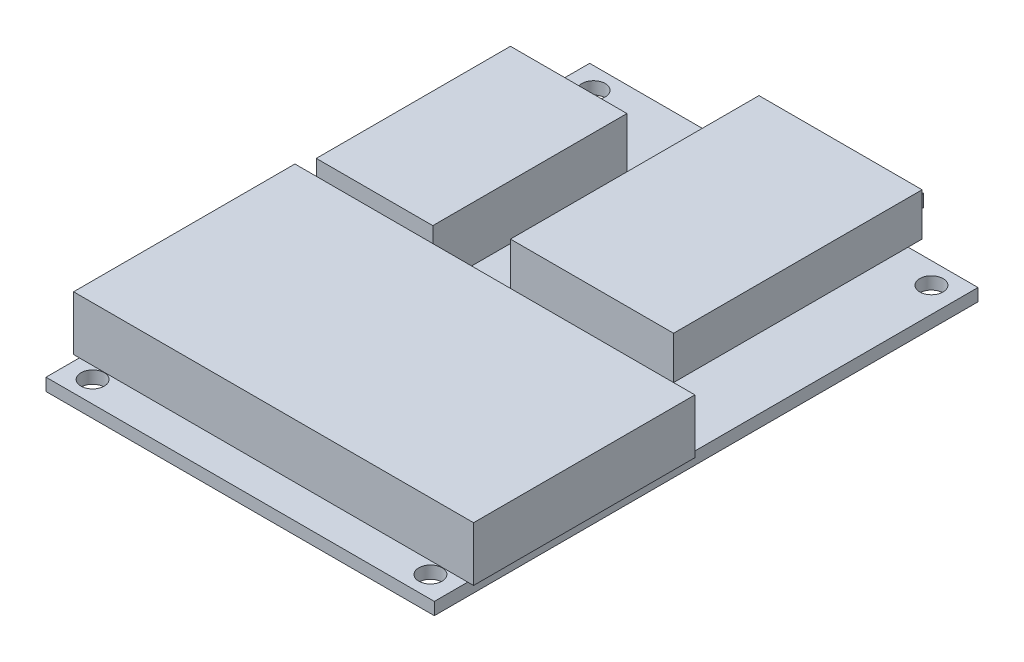
ISO-10303-21;
HEADER;
FILE_DESCRIPTION(('STEP AP214'),'2;1');
FILE_NAME('part.step','',(''),(''),'','','');
FILE_SCHEMA(('AUTOMOTIVE_DESIGN { 1 0 10303 214 1 1 1 1 }'));
ENDSEC;
DATA;
#1=APPLICATION_CONTEXT('core data for automotive mechanical design processes');
#2=APPLICATION_PROTOCOL_DEFINITION('international standard','automotive_design',2000,#1);
#3=PRODUCT_CONTEXT('',#1,'mechanical');
#4=PRODUCT('Part','Part','',(#3));
#5=PRODUCT_RELATED_PRODUCT_CATEGORY('part','',(#4));
#6=PRODUCT_DEFINITION_FORMATION('','',#4);
#7=PRODUCT_DEFINITION_CONTEXT('part definition',#1,'design');
#8=PRODUCT_DEFINITION('design','',#6,#7);
#9=PRODUCT_DEFINITION_SHAPE('','',#8);
#10=(LENGTH_UNIT() NAMED_UNIT(*) SI_UNIT(.MILLI.,.METRE.));
#11=(NAMED_UNIT(*) PLANE_ANGLE_UNIT() SI_UNIT($,.RADIAN.));
#12=(NAMED_UNIT(*) SI_UNIT($,.STERADIAN.) SOLID_ANGLE_UNIT());
#13=UNCERTAINTY_MEASURE_WITH_UNIT(LENGTH_MEASURE(1.E-05),#10,'distance_accuracy_value','');
#14=(GEOMETRIC_REPRESENTATION_CONTEXT(3) GLOBAL_UNCERTAINTY_ASSIGNED_CONTEXT((#13)) GLOBAL_UNIT_ASSIGNED_CONTEXT((#10,
#11,#12)) REPRESENTATION_CONTEXT('',''));
#15=CARTESIAN_POINT('',(0.,0.,0.));
#16=DIRECTION('',(0.,0.,1.));
#17=DIRECTION('',(1.,0.,0.));
#18=AXIS2_PLACEMENT_3D('',#15,#16,#17);
#19=CARTESIAN_POINT('',(0.,1.6,-70.));
#20=DIRECTION('',(0.,0.,1.));
#21=DIRECTION('',(1.,0.,0.));
#22=AXIS2_PLACEMENT_3D('',#19,#20,#21);
#23=PLANE('',#22);
#24=DIRECTION('',(0.,-1.,0.));
#25=VECTOR('',#24,1.);
#26=CARTESIAN_POINT('',(36.,1.6,-70.));
#27=LINE('',#26,#25);
#28=CARTESIAN_POINT('',(36.,1.6,-70.));
#29=VERTEX_POINT('',#28);
#30=CARTESIAN_POINT('',(36.,0.,-70.));
#31=VERTEX_POINT('',#30);
#32=EDGE_CURVE('E232',#29,#31,#27,.T.);
#33=ORIENTED_EDGE('',*,*,#32,.F.);
#34=DIRECTION('',(-1.,0.,0.));
#35=VECTOR('',#34,1.);
#36=CARTESIAN_POINT('',(0.,1.6,-70.));
#37=LINE('',#36,#35);
#38=CARTESIAN_POINT('',(41.,1.6,-70.));
#39=VERTEX_POINT('',#38);
#40=EDGE_CURVE('E377',#39,#29,#37,.T.);
#41=ORIENTED_EDGE('',*,*,#40,.F.);
#42=CARTESIAN_POINT('',(50.,1.6,-70.));
#43=VERTEX_POINT('',#42);
#44=EDGE_CURVE('E373',#43,#39,#37,.T.);
#45=ORIENTED_EDGE('',*,*,#44,.F.);
#46=DIRECTION('',(0.,-1.,0.));
#47=VECTOR('',#46,1.);
#48=CARTESIAN_POINT('',(50.,1.6,-70.));
#49=LINE('',#48,#47);
#50=CARTESIAN_POINT('',(50.,0.,-70.));
#51=VERTEX_POINT('',#50);
#52=EDGE_CURVE('E391',#43,#51,#49,.T.);
#53=ORIENTED_EDGE('',*,*,#52,.T.);
#54=DIRECTION('',(-1.,0.,0.));
#55=VECTOR('',#54,1.);
#56=CARTESIAN_POINT('',(0.,0.,-70.));
#57=LINE('',#56,#55);
#58=EDGE_CURVE('E386',#51,#31,#57,.T.);
#59=ORIENTED_EDGE('',*,*,#58,.T.);
#60=EDGE_LOOP('',(#33,#41,#45,#53,#59));
#61=FACE_BOUND('',#60,.T.);
#62=ADVANCED_FACE('F40',(#61),#23,.F.);
#63=DIRECTION('',(0.,1.,0.));
#64=VECTOR('',#63,1.);
#65=CARTESIAN_POINT('',(25.,1.6,-70.));
#66=LINE('',#65,#64);
#67=CARTESIAN_POINT('',(25.,0.,-70.));
#68=VERTEX_POINT('',#67);
#69=CARTESIAN_POINT('',(25.,1.6,-70.));
#70=VERTEX_POINT('',#69);
#71=EDGE_CURVE('E228',#68,#70,#66,.T.);
#72=ORIENTED_EDGE('',*,*,#71,.F.);
#73=CARTESIAN_POINT('',(0.,0.,-70.));
#74=VERTEX_POINT('',#73);
#75=EDGE_CURVE('E385',#68,#74,#57,.T.);
#76=ORIENTED_EDGE('',*,*,#75,.T.);
#77=DIRECTION('',(0.,-1.,0.));
#78=VECTOR('',#77,1.);
#79=CARTESIAN_POINT('',(0.,1.6,-70.));
#80=LINE('',#79,#78);
#81=CARTESIAN_POINT('',(0.,1.6,-70.));
#82=VERTEX_POINT('',#81);
#83=EDGE_CURVE('E376',#82,#74,#80,.T.);
#84=ORIENTED_EDGE('',*,*,#83,.F.);
#85=CARTESIAN_POINT('',(20.,1.6,-70.));
#86=VERTEX_POINT('',#85);
#87=EDGE_CURVE('E371',#86,#82,#37,.T.);
#88=ORIENTED_EDGE('',*,*,#87,.F.);
#89=EDGE_CURVE('E378',#70,#86,#37,.T.);
#90=ORIENTED_EDGE('',*,*,#89,.F.);
#91=EDGE_LOOP('',(#72,#76,#84,#88,#90));
#92=FACE_BOUND('',#91,.T.);
#93=ADVANCED_FACE('F469',(#92),#23,.F.);
#94=CARTESIAN_POINT('',(0.,1.6,0.));
#95=DIRECTION('',(0.,-1.,0.));
#96=DIRECTION('',(0.,0.,-1.));
#97=AXIS2_PLACEMENT_3D('',#94,#95,#96);
#98=PLANE('',#97);
#99=ORIENTED_EDGE('',*,*,#40,.T.);
#100=DIRECTION('',(0.,0.,1.));
#101=VECTOR('',#100,1.);
#102=CARTESIAN_POINT('',(36.,1.6,-77.));
#103=LINE('',#102,#101);
#104=CARTESIAN_POINT('',(36.,1.6,-71.8));
#105=VERTEX_POINT('',#104);
#106=EDGE_CURVE('E699',#105,#29,#103,.T.);
#107=ORIENTED_EDGE('',*,*,#106,.F.);
#108=DIRECTION('',(-1.,0.,0.));
#109=VECTOR('',#108,1.);
#110=CARTESIAN_POINT('',(20.,1.6,-71.8));
#111=LINE('',#110,#109);
#112=CARTESIAN_POINT('',(41.,1.6,-71.8));
#113=VERTEX_POINT('',#112);
#114=EDGE_CURVE('E245',#113,#105,#111,.T.);
#115=ORIENTED_EDGE('',*,*,#114,.F.);
#116=DIRECTION('',(0.,0.,-1.));
#117=VECTOR('',#116,1.);
#118=CARTESIAN_POINT('',(41.,1.6,-39.8));
#119=LINE('',#118,#117);
#120=EDGE_CURVE('E254',#39,#113,#119,.T.);
#121=ORIENTED_EDGE('',*,*,#120,.F.);
#122=EDGE_LOOP('',(#99,#107,#115,#121));
#123=FACE_BOUND('',#122,.T.);
#124=ADVANCED_FACE('F451',(#123),#98,.T.);
#125=CARTESIAN_POINT('',(25.,1.6,-71.8));
#126=VERTEX_POINT('',#125);
#127=CARTESIAN_POINT('',(20.,1.6,-71.8));
#128=VERTEX_POINT('',#127);
#129=EDGE_CURVE('E258',#126,#128,#111,.T.);
#130=ORIENTED_EDGE('',*,*,#129,.F.);
#131=DIRECTION('',(0.,0.,1.));
#132=VECTOR('',#131,1.);
#133=CARTESIAN_POINT('',(25.,1.6,-77.));
#134=LINE('',#133,#132);
#135=EDGE_CURVE('E694',#126,#70,#134,.T.);
#136=ORIENTED_EDGE('',*,*,#135,.T.);
#137=ORIENTED_EDGE('',*,*,#89,.T.);
#138=DIRECTION('',(0.,0.,1.));
#139=VECTOR('',#138,1.);
#140=CARTESIAN_POINT('',(20.,1.6,-39.8));
#141=LINE('',#140,#139);
#142=EDGE_CURVE('E236',#128,#86,#141,.T.);
#143=ORIENTED_EDGE('',*,*,#142,.F.);
#144=EDGE_LOOP('',(#130,#136,#137,#143));
#145=FACE_BOUND('',#144,.T.);
#146=ADVANCED_FACE('F530',(#145),#98,.T.);
#147=CARTESIAN_POINT('',(0.,1.6,0.));
#148=DIRECTION('',(0.,-1.,0.));
#149=DIRECTION('',(0.,0.,-1.));
#150=AXIS2_PLACEMENT_3D('',#147,#148,#149);
#151=PLANE('',#150);
#152=CARTESIAN_POINT('',(3.25000000000002,1.6,-67.25));
#153=DIRECTION('',(0.,1.,0.));
#154=DIRECTION('',(0.,0.,-1.));
#155=AXIS2_PLACEMENT_3D('',#152,#153,#154);
#156=CIRCLE('',#155,1.5);
#157=CARTESIAN_POINT('',(3.25000000000002,1.6,-68.75));
#158=VERTEX_POINT('',#157);
#159=EDGE_CURVE('E338',#158,#158,#156,.T.);
#160=ORIENTED_EDGE('',*,*,#159,.F.);
#161=EDGE_LOOP('',(#160));
#162=FACE_BOUND('',#161,.T.);
#163=CARTESIAN_POINT('',(46.75,1.6,-67.25));
#164=DIRECTION('',(0.,1.,0.));
#165=DIRECTION('',(0.,0.,1.));
#166=AXIS2_PLACEMENT_3D('',#163,#164,#165);
#167=CIRCLE('',#166,1.5);
#168=CARTESIAN_POINT('',(46.75,1.6,-65.75));
#169=VERTEX_POINT('',#168);
#170=EDGE_CURVE('E344',#169,#169,#167,.T.);
#171=ORIENTED_EDGE('',*,*,#170,.F.);
#172=EDGE_LOOP('',(#171));
#173=FACE_BOUND('',#172,.T.);
#174=CARTESIAN_POINT('',(20.,1.6,-39.8));
#175=VERTEX_POINT('',#174);
#176=EDGE_CURVE('E234',#86,#175,#141,.T.);
#177=ORIENTED_EDGE('',*,*,#176,.F.);
#178=ORIENTED_EDGE('',*,*,#87,.T.);
#179=DIRECTION('',(0.,0.,1.));
#180=VECTOR('',#179,1.);
#181=CARTESIAN_POINT('',(0.,1.6,0.));
#182=LINE('',#181,#180);
#183=CARTESIAN_POINT('',(0.,1.6,-59.8));
#184=VERTEX_POINT('',#183);
#185=EDGE_CURVE('E362',#82,#184,#182,.T.);
#186=ORIENTED_EDGE('',*,*,#185,.T.);
#187=DIRECTION('',(-1.,0.,0.));
#188=VECTOR('',#187,1.);
#189=CARTESIAN_POINT('',(0.,1.6,-59.8));
#190=LINE('',#189,#188);
#191=CARTESIAN_POINT('',(15.,1.6,-59.8));
#192=VERTEX_POINT('',#191);
#193=EDGE_CURVE('E290',#192,#184,#190,.T.);
#194=ORIENTED_EDGE('',*,*,#193,.F.);
#195=DIRECTION('',(0.,0.,-1.));
#196=VECTOR('',#195,1.);
#197=CARTESIAN_POINT('',(15.,1.6,-34.8));
#198=LINE('',#197,#196);
#199=CARTESIAN_POINT('',(15.,1.6,-34.8));
#200=VERTEX_POINT('',#199);
#201=EDGE_CURVE('E287',#200,#192,#198,.T.);
#202=ORIENTED_EDGE('',*,*,#201,.F.);
#203=DIRECTION('',(1.,0.,0.));
#204=VECTOR('',#203,1.);
#205=CARTESIAN_POINT('',(0.,1.6,-34.8));
#206=LINE('',#205,#204);
#207=CARTESIAN_POINT('',(0.,1.6,-34.8));
#208=VERTEX_POINT('',#207);
#209=EDGE_CURVE('E273',#208,#200,#206,.T.);
#210=ORIENTED_EDGE('',*,*,#209,.F.);
#211=CARTESIAN_POINT('',(0.,1.6,-32.8));
#212=VERTEX_POINT('',#211);
#213=EDGE_CURVE('E365',#208,#212,#182,.T.);
#214=ORIENTED_EDGE('',*,*,#213,.T.);
#215=DIRECTION('',(-1.,0.,0.));
#216=VECTOR('',#215,1.);
#217=CARTESIAN_POINT('',(-0.750000000000001,1.6,-32.8));
#218=LINE('',#217,#216);
#219=CARTESIAN_POINT('',(50.,1.6,-32.8));
#220=VERTEX_POINT('',#219);
#221=EDGE_CURVE('E11',#220,#212,#218,.T.);
#222=ORIENTED_EDGE('',*,*,#221,.F.);
#223=DIRECTION('',(0.,0.,-1.));
#224=VECTOR('',#223,1.);
#225=CARTESIAN_POINT('',(50.,1.6,0.));
#226=LINE('',#225,#224);
#227=EDGE_CURVE('E368',#220,#43,#226,.T.);
#228=ORIENTED_EDGE('',*,*,#227,.T.);
#229=ORIENTED_EDGE('',*,*,#44,.T.);
#230=CARTESIAN_POINT('',(41.,1.6,-39.8));
#231=VERTEX_POINT('',#230);
#232=EDGE_CURVE('E255',#231,#39,#119,.T.);
#233=ORIENTED_EDGE('',*,*,#232,.F.);
#234=DIRECTION('',(1.,0.,0.));
#235=VECTOR('',#234,1.);
#236=CARTESIAN_POINT('',(20.,1.6,-39.8));
#237=LINE('',#236,#235);
#238=EDGE_CURVE('E67',#175,#231,#237,.T.);
#239=ORIENTED_EDGE('',*,*,#238,.F.);
#240=EDGE_LOOP('',(#177,#178,#186,#194,#202,#210,#214,#222,#228,#229,#233,#239));
#241=FACE_BOUND('',#240,.T.);
#242=ADVANCED_FACE('F448',(#162,#173,#241),#151,.F.);
#243=CARTESIAN_POINT('',(46.75,1.6,-2.75000000000001));
#244=DIRECTION('',(0.,1.,0.));
#245=DIRECTION('',(0.,0.,-1.));
#246=AXIS2_PLACEMENT_3D('',#243,#244,#245);
#247=CIRCLE('',#246,1.5);
#248=CARTESIAN_POINT('',(46.75,1.6,-4.25000000000002));
#249=VERTEX_POINT('',#248);
#250=EDGE_CURVE('E350',#249,#249,#247,.T.);
#251=ORIENTED_EDGE('',*,*,#250,.F.);
#252=EDGE_LOOP('',(#251));
#253=FACE_BOUND('',#252,.T.);
#254=CARTESIAN_POINT('',(3.25,1.6,-2.75000000000001));
#255=DIRECTION('',(0.,1.,0.));
#256=DIRECTION('',(0.,0.,1.));
#257=AXIS2_PLACEMENT_3D('',#254,#255,#256);
#258=CIRCLE('',#257,1.5);
#259=CARTESIAN_POINT('',(3.25,1.6,-1.25000000000001));
#260=VERTEX_POINT('',#259);
#261=EDGE_CURVE('E356',#260,#260,#258,.T.);
#262=ORIENTED_EDGE('',*,*,#261,.F.);
#263=EDGE_LOOP('',(#262));
#264=FACE_BOUND('',#263,.T.);
#265=DIRECTION('',(1.,0.,0.));
#266=VECTOR('',#265,1.);
#267=CARTESIAN_POINT('',(-0.750000000000001,1.6,-4.3));
#268=LINE('',#267,#266);
#269=CARTESIAN_POINT('',(0.,1.6,-4.3));
#270=VERTEX_POINT('',#269);
#271=CARTESIAN_POINT('',(50.,1.6,-4.3));
#272=VERTEX_POINT('',#271);
#273=EDGE_CURVE('E49',#270,#272,#268,.T.);
#274=ORIENTED_EDGE('',*,*,#273,.F.);
#275=CARTESIAN_POINT('',(0.,1.6,0.));
#276=VERTEX_POINT('',#275);
#277=EDGE_CURVE('E388',#270,#276,#182,.T.);
#278=ORIENTED_EDGE('',*,*,#277,.T.);
#279=DIRECTION('',(1.,0.,0.));
#280=VECTOR('',#279,1.);
#281=CARTESIAN_POINT('',(0.,1.6,0.));
#282=LINE('',#281,#280);
#283=CARTESIAN_POINT('',(50.,1.6,0.));
#284=VERTEX_POINT('',#283);
#285=EDGE_CURVE('E364',#276,#284,#282,.T.);
#286=ORIENTED_EDGE('',*,*,#285,.T.);
#287=EDGE_CURVE('E369',#284,#272,#226,.T.);
#288=ORIENTED_EDGE('',*,*,#287,.T.);
#289=EDGE_LOOP('',(#274,#278,#286,#288));
#290=FACE_BOUND('',#289,.T.);
#291=ADVANCED_FACE('F437',(#253,#264,#290),#151,.F.);
#292=CARTESIAN_POINT('',(0.,0.,0.));
#293=DIRECTION('',(0.,-1.,0.));
#294=DIRECTION('',(0.,0.,-1.));
#295=AXIS2_PLACEMENT_3D('',#292,#293,#294);
#296=PLANE('',#295);
#297=CARTESIAN_POINT('',(46.75,0.,-67.25));
#298=DIRECTION('',(0.,1.,0.));
#299=DIRECTION('',(0.,0.,1.));
#300=AXIS2_PLACEMENT_3D('',#297,#298,#299);
#301=CIRCLE('',#300,1.5);
#302=CARTESIAN_POINT('',(46.75,0.,-65.75));
#303=VERTEX_POINT('',#302);
#304=EDGE_CURVE('E341',#303,#303,#301,.T.);
#305=ORIENTED_EDGE('',*,*,#304,.T.);
#306=EDGE_LOOP('',(#305));
#307=FACE_BOUND('',#306,.T.);
#308=CARTESIAN_POINT('',(3.25,0.,-2.75000000000001));
#309=DIRECTION('',(0.,1.,0.));
#310=DIRECTION('',(0.,0.,1.));
#311=AXIS2_PLACEMENT_3D('',#308,#309,#310);
#312=CIRCLE('',#311,1.5);
#313=CARTESIAN_POINT('',(3.25,0.,-1.25000000000001));
#314=VERTEX_POINT('',#313);
#315=EDGE_CURVE('E353',#314,#314,#312,.T.);
#316=ORIENTED_EDGE('',*,*,#315,.T.);
#317=EDGE_LOOP('',(#316));
#318=FACE_BOUND('',#317,.T.);
#319=DIRECTION('',(0.,0.,1.));
#320=VECTOR('',#319,1.);
#321=CARTESIAN_POINT('',(0.,0.,0.));
#322=LINE('',#321,#320);
#323=CARTESIAN_POINT('',(0.,0.,0.));
#324=VERTEX_POINT('',#323);
#325=EDGE_CURVE('E359',#74,#324,#322,.T.);
#326=ORIENTED_EDGE('',*,*,#325,.F.);
#327=ORIENTED_EDGE('',*,*,#75,.F.);
#328=DIRECTION('',(0.,0.,1.));
#329=VECTOR('',#328,1.);
#330=CARTESIAN_POINT('',(25.,0.,-77.));
#331=LINE('',#330,#329);
#332=CARTESIAN_POINT('',(25.,0.,-77.));
#333=VERTEX_POINT('',#332);
#334=EDGE_CURVE('E216',#333,#68,#331,.T.);
#335=ORIENTED_EDGE('',*,*,#334,.F.);
#336=DIRECTION('',(-1.,0.,0.));
#337=VECTOR('',#336,1.);
#338=CARTESIAN_POINT('',(36.,0.,-77.));
#339=LINE('',#338,#337);
#340=CARTESIAN_POINT('',(36.,0.,-77.));
#341=VERTEX_POINT('',#340);
#342=EDGE_CURVE('E206',#341,#333,#339,.T.);
#343=ORIENTED_EDGE('',*,*,#342,.F.);
#344=DIRECTION('',(0.,0.,1.));
#345=VECTOR('',#344,1.);
#346=CARTESIAN_POINT('',(36.,0.,-77.));
#347=LINE('',#346,#345);
#348=EDGE_CURVE('E213',#341,#31,#347,.T.);
#349=ORIENTED_EDGE('',*,*,#348,.T.);
#350=ORIENTED_EDGE('',*,*,#58,.F.);
#351=DIRECTION('',(0.,0.,-1.));
#352=VECTOR('',#351,1.);
#353=CARTESIAN_POINT('',(50.,0.,0.));
#354=LINE('',#353,#352);
#355=CARTESIAN_POINT('',(50.,0.,0.));
#356=VERTEX_POINT('',#355);
#357=EDGE_CURVE('E383',#356,#51,#354,.T.);
#358=ORIENTED_EDGE('',*,*,#357,.F.);
#359=DIRECTION('',(1.,0.,0.));
#360=VECTOR('',#359,1.);
#361=CARTESIAN_POINT('',(0.,0.,0.));
#362=LINE('',#361,#360);
#363=EDGE_CURVE('E381',#324,#356,#362,.T.);
#364=ORIENTED_EDGE('',*,*,#363,.F.);
#365=EDGE_LOOP('',(#326,#327,#335,#343,#349,#350,#358,#364));
#366=FACE_BOUND('',#365,.T.);
#367=CARTESIAN_POINT('',(46.75,0.,-2.75000000000001));
#368=DIRECTION('',(0.,1.,0.));
#369=DIRECTION('',(0.,0.,-1.));
#370=AXIS2_PLACEMENT_3D('',#367,#368,#369);
#371=CIRCLE('',#370,1.5);
#372=CARTESIAN_POINT('',(46.75,0.,-4.25000000000002));
#373=VERTEX_POINT('',#372);
#374=EDGE_CURVE('E347',#373,#373,#371,.T.);
#375=ORIENTED_EDGE('',*,*,#374,.T.);
#376=EDGE_LOOP('',(#375));
#377=FACE_BOUND('',#376,.T.);
#378=CARTESIAN_POINT('',(3.25000000000002,0.,-67.25));
#379=DIRECTION('',(0.,1.,0.));
#380=DIRECTION('',(0.,0.,-1.));
#381=AXIS2_PLACEMENT_3D('',#378,#379,#380);
#382=CIRCLE('',#381,1.5);
#383=CARTESIAN_POINT('',(3.25000000000002,0.,-68.75));
#384=VERTEX_POINT('',#383);
#385=EDGE_CURVE('E337',#384,#384,#382,.T.);
#386=ORIENTED_EDGE('',*,*,#385,.T.);
#387=EDGE_LOOP('',(#386));
#388=FACE_BOUND('',#387,.T.);
#389=ADVANCED_FACE('F209',(#307,#318,#366,#377,#388),#296,.T.);
#390=CARTESIAN_POINT('',(0.,1.6,0.));
#391=DIRECTION('',(1.,0.,0.));
#392=DIRECTION('',(0.,0.,-1.));
#393=AXIS2_PLACEMENT_3D('',#390,#391,#392);
#394=PLANE('',#393);
#395=ORIENTED_EDGE('',*,*,#325,.T.);
#396=DIRECTION('',(0.,-1.,0.));
#397=VECTOR('',#396,1.);
#398=CARTESIAN_POINT('',(0.,1.6,0.));
#399=LINE('',#398,#397);
#400=EDGE_CURVE('E44',#276,#324,#399,.T.);
#401=ORIENTED_EDGE('',*,*,#400,.F.);
#402=ORIENTED_EDGE('',*,*,#277,.F.);
#403=EDGE_CURVE('E366',#212,#270,#182,.T.);
#404=ORIENTED_EDGE('',*,*,#403,.F.);
#405=ORIENTED_EDGE('',*,*,#213,.F.);
#406=DIRECTION('',(0.,-1.,0.));
#407=VECTOR('',#406,1.);
#408=CARTESIAN_POINT('',(0.,37.7547594742265,-34.8));
#409=LINE('',#408,#407);
#410=CARTESIAN_POINT('',(0.,8.6,-34.8));
#411=VERTEX_POINT('',#410);
#412=EDGE_CURVE('E302',#411,#208,#409,.T.);
#413=ORIENTED_EDGE('',*,*,#412,.F.);
#414=DIRECTION('',(0.,0.,-1.));
#415=VECTOR('',#414,1.);
#416=CARTESIAN_POINT('',(0.,8.6,-34.8));
#417=LINE('',#416,#415);
#418=CARTESIAN_POINT('',(0.,8.6,-59.8));
#419=VERTEX_POINT('',#418);
#420=EDGE_CURVE('E281',#411,#419,#417,.T.);
#421=ORIENTED_EDGE('',*,*,#420,.T.);
#422=DIRECTION('',(0.,-1.,0.));
#423=VECTOR('',#422,1.);
#424=CARTESIAN_POINT('',(0.,37.7547594742265,-59.8));
#425=LINE('',#424,#423);
#426=EDGE_CURVE('E293',#419,#184,#425,.T.);
#427=ORIENTED_EDGE('',*,*,#426,.T.);
#428=ORIENTED_EDGE('',*,*,#185,.F.);
#429=ORIENTED_EDGE('',*,*,#83,.T.);
#430=EDGE_LOOP('',(#395,#401,#402,#404,#405,#413,#421,#427,#428,#429));
#431=FACE_BOUND('',#430,.T.);
#432=ADVANCED_FACE('F42',(#431),#394,.F.);
#433=CARTESIAN_POINT('',(0.,1.6,0.));
#434=DIRECTION('',(0.,0.,-1.));
#435=DIRECTION('',(-1.,0.,0.));
#436=AXIS2_PLACEMENT_3D('',#433,#434,#435);
#437=PLANE('',#436);
#438=ORIENTED_EDGE('',*,*,#363,.T.);
#439=DIRECTION('',(0.,-1.,0.));
#440=VECTOR('',#439,1.);
#441=CARTESIAN_POINT('',(50.,1.6,0.));
#442=LINE('',#441,#440);
#443=EDGE_CURVE('E393',#284,#356,#442,.T.);
#444=ORIENTED_EDGE('',*,*,#443,.F.);
#445=ORIENTED_EDGE('',*,*,#285,.F.);
#446=ORIENTED_EDGE('',*,*,#400,.T.);
#447=EDGE_LOOP('',(#438,#444,#445,#446));
#448=FACE_BOUND('',#447,.T.);
#449=ADVANCED_FACE('F438',(#448),#437,.F.);
#450=CARTESIAN_POINT('',(50.,1.6,0.));
#451=DIRECTION('',(-1.,0.,0.));
#452=DIRECTION('',(0.,0.,1.));
#453=AXIS2_PLACEMENT_3D('',#450,#451,#452);
#454=PLANE('',#453);
#455=ORIENTED_EDGE('',*,*,#357,.T.);
#456=ORIENTED_EDGE('',*,*,#52,.F.);
#457=ORIENTED_EDGE('',*,*,#227,.F.);
#458=EDGE_CURVE('E372',#272,#220,#226,.T.);
#459=ORIENTED_EDGE('',*,*,#458,.F.);
#460=ORIENTED_EDGE('',*,*,#287,.F.);
#461=ORIENTED_EDGE('',*,*,#443,.T.);
#462=EDGE_LOOP('',(#455,#456,#457,#459,#460,#461));
#463=FACE_BOUND('',#462,.T.);
#464=ADVANCED_FACE('F442',(#463),#454,.F.);
#465=CARTESIAN_POINT('',(3.25,1.6,-2.75000000000001));
#466=DIRECTION('',(0.,-1.,0.));
#467=DIRECTION('',(0.,0.,-1.));
#468=AXIS2_PLACEMENT_3D('',#465,#466,#467);
#469=CYLINDRICAL_SURFACE('',#468,1.5);
#470=ORIENTED_EDGE('',*,*,#261,.T.);
#471=EDGE_LOOP('',(#470));
#472=FACE_BOUND('',#471,.T.);
#473=ORIENTED_EDGE('',*,*,#315,.F.);
#474=EDGE_LOOP('',(#473));
#475=FACE_BOUND('',#474,.T.);
#476=ADVANCED_FACE('F501',(#472,#475),#469,.F.);
#477=CARTESIAN_POINT('',(46.75,1.6,-2.75000000000001));
#478=DIRECTION('',(0.,-1.,0.));
#479=DIRECTION('',(0.,0.,-1.));
#480=AXIS2_PLACEMENT_3D('',#477,#478,#479);
#481=CYLINDRICAL_SURFACE('',#480,1.5);
#482=ORIENTED_EDGE('',*,*,#250,.T.);
#483=EDGE_LOOP('',(#482));
#484=FACE_BOUND('',#483,.T.);
#485=ORIENTED_EDGE('',*,*,#374,.F.);
#486=EDGE_LOOP('',(#485));
#487=FACE_BOUND('',#486,.T.);
#488=ADVANCED_FACE('F519',(#484,#487),#481,.F.);
#489=CARTESIAN_POINT('',(46.75,1.6,-67.25));
#490=DIRECTION('',(0.,-1.,0.));
#491=DIRECTION('',(0.,0.,-1.));
#492=AXIS2_PLACEMENT_3D('',#489,#490,#491);
#493=CYLINDRICAL_SURFACE('',#492,1.5);
#494=ORIENTED_EDGE('',*,*,#170,.T.);
#495=EDGE_LOOP('',(#494));
#496=FACE_BOUND('',#495,.T.);
#497=ORIENTED_EDGE('',*,*,#304,.F.);
#498=EDGE_LOOP('',(#497));
#499=FACE_BOUND('',#498,.T.);
#500=ADVANCED_FACE('F525',(#496,#499),#493,.F.);
#501=CARTESIAN_POINT('',(3.25000000000002,1.6,-67.25));
#502=DIRECTION('',(0.,-1.,0.));
#503=DIRECTION('',(0.,0.,-1.));
#504=AXIS2_PLACEMENT_3D('',#501,#502,#503);
#505=CYLINDRICAL_SURFACE('',#504,1.5);
#506=ORIENTED_EDGE('',*,*,#159,.T.);
#507=EDGE_LOOP('',(#506));
#508=FACE_BOUND('',#507,.T.);
#509=ORIENTED_EDGE('',*,*,#385,.F.);
#510=EDGE_LOOP('',(#509));
#511=FACE_BOUND('',#510,.T.);
#512=ADVANCED_FACE('F543',(#508,#511),#505,.F.);
#513=CARTESIAN_POINT('',(0.,1.6,0.));
#514=DIRECTION('',(0.,-1.,0.));
#515=DIRECTION('',(0.,0.,-1.));
#516=AXIS2_PLACEMENT_3D('',#513,#514,#515);
#517=PLANE('',#516);
#518=CARTESIAN_POINT('',(-0.750000000000001,1.6,-32.8));
#519=VERTEX_POINT('',#518);
#520=EDGE_CURVE('E52',#212,#519,#218,.T.);
#521=ORIENTED_EDGE('',*,*,#520,.F.);
#522=ORIENTED_EDGE('',*,*,#403,.T.);
#523=CARTESIAN_POINT('',(-0.750000000000001,1.6,-4.3));
#524=VERTEX_POINT('',#523);
#525=EDGE_CURVE('E320',#524,#270,#268,.T.);
#526=ORIENTED_EDGE('',*,*,#525,.F.);
#527=DIRECTION('',(0.,0.,1.));
#528=VECTOR('',#527,1.);
#529=CARTESIAN_POINT('',(-0.750000000000001,1.6,-4.3));
#530=LINE('',#529,#528);
#531=EDGE_CURVE('E284',#519,#524,#530,.T.);
#532=ORIENTED_EDGE('',*,*,#531,.F.);
#533=EDGE_LOOP('',(#521,#522,#526,#532));
#534=FACE_BOUND('',#533,.T.);
#535=ADVANCED_FACE('F431',(#534),#517,.T.);
#536=CARTESIAN_POINT('',(-0.750000000000001,8.6,-4.3));
#537=DIRECTION('',(1.,0.,0.));
#538=DIRECTION('',(0.,0.,-1.));
#539=AXIS2_PLACEMENT_3D('',#536,#537,#538);
#540=PLANE('',#539);
#541=ORIENTED_EDGE('',*,*,#531,.T.);
#542=DIRECTION('',(0.,-1.,0.));
#543=VECTOR('',#542,1.);
#544=CARTESIAN_POINT('',(-0.750000000000001,8.6,-4.3));
#545=LINE('',#544,#543);
#546=CARTESIAN_POINT('',(-0.750000000000001,8.6,-4.3));
#547=VERTEX_POINT('',#546);
#548=EDGE_CURVE('E334',#547,#524,#545,.T.);
#549=ORIENTED_EDGE('',*,*,#548,.F.);
#550=DIRECTION('',(0.,0.,1.));
#551=VECTOR('',#550,1.);
#552=CARTESIAN_POINT('',(-0.750000000000001,8.6,-4.3));
#553=LINE('',#552,#551);
#554=CARTESIAN_POINT('',(-0.750000000000001,8.6,-32.8));
#555=VERTEX_POINT('',#554);
#556=EDGE_CURVE('E307',#555,#547,#553,.T.);
#557=ORIENTED_EDGE('',*,*,#556,.F.);
#558=DIRECTION('',(0.,-1.,0.));
#559=VECTOR('',#558,1.);
#560=CARTESIAN_POINT('',(-0.750000000000001,8.6,-32.8));
#561=LINE('',#560,#559);
#562=EDGE_CURVE('E316',#555,#519,#561,.T.);
#563=ORIENTED_EDGE('',*,*,#562,.T.);
#564=EDGE_LOOP('',(#541,#549,#557,#563));
#565=FACE_BOUND('',#564,.T.);
#566=ADVANCED_FACE('F428',(#565),#540,.F.);
#567=CARTESIAN_POINT('',(-0.750000000000001,8.6,-4.3));
#568=DIRECTION('',(0.,0.,-1.));
#569=DIRECTION('',(-1.,0.,0.));
#570=AXIS2_PLACEMENT_3D('',#567,#568,#569);
#571=PLANE('',#570);
#572=ORIENTED_EDGE('',*,*,#525,.T.);
#573=ORIENTED_EDGE('',*,*,#273,.T.);
#574=CARTESIAN_POINT('',(50.75,1.6,-4.3));
#575=VERTEX_POINT('',#574);
#576=EDGE_CURVE('E319',#272,#575,#268,.T.);
#577=ORIENTED_EDGE('',*,*,#576,.T.);
#578=DIRECTION('',(0.,-1.,0.));
#579=VECTOR('',#578,1.);
#580=CARTESIAN_POINT('',(50.75,8.6,-4.3));
#581=LINE('',#580,#579);
#582=CARTESIAN_POINT('',(50.75,8.6,-4.3));
#583=VERTEX_POINT('',#582);
#584=EDGE_CURVE('E331',#583,#575,#581,.T.);
#585=ORIENTED_EDGE('',*,*,#584,.F.);
#586=DIRECTION('',(1.,0.,0.));
#587=VECTOR('',#586,1.);
#588=CARTESIAN_POINT('',(-0.750000000000001,8.6,-4.3));
#589=LINE('',#588,#587);
#590=EDGE_CURVE('E310',#547,#583,#589,.T.);
#591=ORIENTED_EDGE('',*,*,#590,.F.);
#592=ORIENTED_EDGE('',*,*,#548,.T.);
#593=EDGE_LOOP('',(#572,#573,#577,#585,#591,#592));
#594=FACE_BOUND('',#593,.T.);
#595=ADVANCED_FACE('F407',(#594),#571,.F.);
#596=CARTESIAN_POINT('',(50.75,8.6,-4.3));
#597=DIRECTION('',(-1.,0.,0.));
#598=DIRECTION('',(0.,0.,1.));
#599=AXIS2_PLACEMENT_3D('',#596,#597,#598);
#600=PLANE('',#599);
#601=DIRECTION('',(0.,0.,-1.));
#602=VECTOR('',#601,1.);
#603=CARTESIAN_POINT('',(50.75,1.6,-4.3));
#604=LINE('',#603,#602);
#605=CARTESIAN_POINT('',(50.75,1.6,-32.8));
#606=VERTEX_POINT('',#605);
#607=EDGE_CURVE('E323',#575,#606,#604,.T.);
#608=ORIENTED_EDGE('',*,*,#607,.T.);
#609=DIRECTION('',(0.,-1.,0.));
#610=VECTOR('',#609,1.);
#611=CARTESIAN_POINT('',(50.75,8.6,-32.8));
#612=LINE('',#611,#610);
#613=CARTESIAN_POINT('',(50.75,8.6,-32.8));
#614=VERTEX_POINT('',#613);
#615=EDGE_CURVE('E328',#614,#606,#612,.T.);
#616=ORIENTED_EDGE('',*,*,#615,.F.);
#617=DIRECTION('',(0.,0.,-1.));
#618=VECTOR('',#617,1.);
#619=CARTESIAN_POINT('',(50.75,8.6,-4.3));
#620=LINE('',#619,#618);
#621=EDGE_CURVE('E312',#583,#614,#620,.T.);
#622=ORIENTED_EDGE('',*,*,#621,.F.);
#623=ORIENTED_EDGE('',*,*,#584,.T.);
#624=EDGE_LOOP('',(#608,#616,#622,#623));
#625=FACE_BOUND('',#624,.T.);
#626=ADVANCED_FACE('F413',(#625),#600,.F.);
#627=CARTESIAN_POINT('',(-0.750000000000001,8.6,-32.8));
#628=DIRECTION('',(0.,0.,1.));
#629=DIRECTION('',(1.,0.,0.));
#630=AXIS2_PLACEMENT_3D('',#627,#628,#629);
#631=PLANE('',#630);
#632=EDGE_CURVE('E51',#606,#220,#218,.T.);
#633=ORIENTED_EDGE('',*,*,#632,.T.);
#634=ORIENTED_EDGE('',*,*,#221,.T.);
#635=ORIENTED_EDGE('',*,*,#520,.T.);
#636=ORIENTED_EDGE('',*,*,#562,.F.);
#637=DIRECTION('',(-1.,0.,0.));
#638=VECTOR('',#637,1.);
#639=CARTESIAN_POINT('',(-0.750000000000001,8.6,-32.8));
#640=LINE('',#639,#638);
#641=EDGE_CURVE('E314',#614,#555,#640,.T.);
#642=ORIENTED_EDGE('',*,*,#641,.F.);
#643=ORIENTED_EDGE('',*,*,#615,.T.);
#644=EDGE_LOOP('',(#633,#634,#635,#636,#642,#643));
#645=FACE_BOUND('',#644,.T.);
#646=ADVANCED_FACE('F419',(#645),#631,.F.);
#647=CARTESIAN_POINT('',(0.,8.6,0.));
#648=DIRECTION('',(0.,-1.,0.));
#649=DIRECTION('',(0.,0.,-1.));
#650=AXIS2_PLACEMENT_3D('',#647,#648,#649);
#651=PLANE('',#650);
#652=ORIENTED_EDGE('',*,*,#556,.T.);
#653=ORIENTED_EDGE('',*,*,#590,.T.);
#654=ORIENTED_EDGE('',*,*,#621,.T.);
#655=ORIENTED_EDGE('',*,*,#641,.T.);
#656=EDGE_LOOP('',(#652,#653,#654,#655));
#657=FACE_BOUND('',#656,.T.);
#658=ADVANCED_FACE('F424',(#657),#651,.F.);
#659=ORIENTED_EDGE('',*,*,#576,.F.);
#660=ORIENTED_EDGE('',*,*,#458,.T.);
#661=ORIENTED_EDGE('',*,*,#632,.F.);
#662=ORIENTED_EDGE('',*,*,#607,.F.);
#663=EDGE_LOOP('',(#659,#660,#661,#662));
#664=FACE_BOUND('',#663,.T.);
#665=ADVANCED_FACE('F416',(#664),#517,.T.);
#666=CARTESIAN_POINT('',(0.,37.7547594742265,-59.8));
#667=DIRECTION('',(0.,0.,1.));
#668=DIRECTION('',(1.,0.,0.));
#669=AXIS2_PLACEMENT_3D('',#666,#667,#668);
#670=PLANE('',#669);
#671=ORIENTED_EDGE('',*,*,#426,.F.);
#672=DIRECTION('',(1.,0.,0.));
#673=VECTOR('',#672,1.);
#674=CARTESIAN_POINT('',(0.,8.6,-59.8));
#675=LINE('',#674,#673);
#676=CARTESIAN_POINT('',(15.,8.6,-59.8));
#677=VERTEX_POINT('',#676);
#678=EDGE_CURVE('E278',#419,#677,#675,.T.);
#679=ORIENTED_EDGE('',*,*,#678,.T.);
#680=DIRECTION('',(0.,-1.,0.));
#681=VECTOR('',#680,1.);
#682=CARTESIAN_POINT('',(15.,37.7547594742265,-59.8));
#683=LINE('',#682,#681);
#684=EDGE_CURVE('E296',#677,#192,#683,.T.);
#685=ORIENTED_EDGE('',*,*,#684,.T.);
#686=ORIENTED_EDGE('',*,*,#193,.T.);
#687=EDGE_LOOP('',(#671,#679,#685,#686));
#688=FACE_BOUND('',#687,.T.);
#689=ADVANCED_FACE('F473',(#688),#670,.F.);
#690=CARTESIAN_POINT('',(15.,37.7547594742265,-34.8));
#691=DIRECTION('',(-1.,0.,0.));
#692=DIRECTION('',(0.,0.,1.));
#693=AXIS2_PLACEMENT_3D('',#690,#691,#692);
#694=PLANE('',#693);
#695=ORIENTED_EDGE('',*,*,#684,.F.);
#696=DIRECTION('',(0.,0.,1.));
#697=VECTOR('',#696,1.);
#698=CARTESIAN_POINT('',(15.,8.6,-34.8));
#699=LINE('',#698,#697);
#700=CARTESIAN_POINT('',(15.,8.6,-34.8));
#701=VERTEX_POINT('',#700);
#702=EDGE_CURVE('E274',#677,#701,#699,.T.);
#703=ORIENTED_EDGE('',*,*,#702,.T.);
#704=DIRECTION('',(0.,-1.,0.));
#705=VECTOR('',#704,1.);
#706=CARTESIAN_POINT('',(15.,37.7547594742265,-34.8));
#707=LINE('',#706,#705);
#708=EDGE_CURVE('E299',#701,#200,#707,.T.);
#709=ORIENTED_EDGE('',*,*,#708,.T.);
#710=ORIENTED_EDGE('',*,*,#201,.T.);
#711=EDGE_LOOP('',(#695,#703,#709,#710));
#712=FACE_BOUND('',#711,.T.);
#713=ADVANCED_FACE('F478',(#712),#694,.F.);
#714=CARTESIAN_POINT('',(0.,37.7547594742265,-34.8));
#715=DIRECTION('',(0.,0.,-1.));
#716=DIRECTION('',(-1.,0.,0.));
#717=AXIS2_PLACEMENT_3D('',#714,#715,#716);
#718=PLANE('',#717);
#719=ORIENTED_EDGE('',*,*,#708,.F.);
#720=DIRECTION('',(-1.,0.,0.));
#721=VECTOR('',#720,1.);
#722=CARTESIAN_POINT('',(0.,8.6,-34.8));
#723=LINE('',#722,#721);
#724=EDGE_CURVE('E277',#701,#411,#723,.T.);
#725=ORIENTED_EDGE('',*,*,#724,.T.);
#726=ORIENTED_EDGE('',*,*,#412,.T.);
#727=ORIENTED_EDGE('',*,*,#209,.T.);
#728=EDGE_LOOP('',(#719,#725,#726,#727));
#729=FACE_BOUND('',#728,.T.);
#730=ADVANCED_FACE('F480',(#729),#718,.F.);
#731=CARTESIAN_POINT('',(0.,8.6,0.));
#732=DIRECTION('',(0.,-1.,0.));
#733=DIRECTION('',(0.,0.,-1.));
#734=AXIS2_PLACEMENT_3D('',#731,#732,#733);
#735=PLANE('',#734);
#736=ORIENTED_EDGE('',*,*,#724,.F.);
#737=ORIENTED_EDGE('',*,*,#702,.F.);
#738=ORIENTED_EDGE('',*,*,#678,.F.);
#739=ORIENTED_EDGE('',*,*,#420,.F.);
#740=EDGE_LOOP('',(#736,#737,#738,#739));
#741=FACE_BOUND('',#740,.T.);
#742=ADVANCED_FACE('F482',(#741),#735,.F.);
#743=CARTESIAN_POINT('',(20.,7.1,-39.8));
#744=DIRECTION('',(1.,0.,0.));
#745=DIRECTION('',(0.,0.,-1.));
#746=AXIS2_PLACEMENT_3D('',#743,#744,#745);
#747=PLANE('',#746);
#748=ORIENTED_EDGE('',*,*,#142,.T.);
#749=ORIENTED_EDGE('',*,*,#176,.T.);
#750=DIRECTION('',(0.,-1.,0.));
#751=VECTOR('',#750,1.);
#752=CARTESIAN_POINT('',(20.,7.1,-39.8));
#753=LINE('',#752,#751);
#754=CARTESIAN_POINT('',(20.,7.1,-39.8));
#755=VERTEX_POINT('',#754);
#756=EDGE_CURVE('E270',#755,#175,#753,.T.);
#757=ORIENTED_EDGE('',*,*,#756,.F.);
#758=DIRECTION('',(0.,0.,1.));
#759=VECTOR('',#758,1.);
#760=CARTESIAN_POINT('',(20.,7.1,-39.8));
#761=LINE('',#760,#759);
#762=CARTESIAN_POINT('',(20.,7.1,-71.8));
#763=VERTEX_POINT('',#762);
#764=EDGE_CURVE('E241',#763,#755,#761,.T.);
#765=ORIENTED_EDGE('',*,*,#764,.F.);
#766=DIRECTION('',(0.,-1.,0.));
#767=VECTOR('',#766,1.);
#768=CARTESIAN_POINT('',(20.,7.1,-71.8));
#769=LINE('',#768,#767);
#770=EDGE_CURVE('E250',#763,#128,#769,.T.);
#771=ORIENTED_EDGE('',*,*,#770,.T.);
#772=EDGE_LOOP('',(#748,#749,#757,#765,#771));
#773=FACE_BOUND('',#772,.T.);
#774=ADVANCED_FACE('F463',(#773),#747,.F.);
#775=CARTESIAN_POINT('',(20.,7.1,-39.8));
#776=DIRECTION('',(0.,0.,-1.));
#777=DIRECTION('',(-1.,0.,0.));
#778=AXIS2_PLACEMENT_3D('',#775,#776,#777);
#779=PLANE('',#778);
#780=ORIENTED_EDGE('',*,*,#238,.T.);
#781=DIRECTION('',(0.,-1.,0.));
#782=VECTOR('',#781,1.);
#783=CARTESIAN_POINT('',(41.,7.1,-39.8));
#784=LINE('',#783,#782);
#785=CARTESIAN_POINT('',(41.,7.1,-39.8));
#786=VERTEX_POINT('',#785);
#787=EDGE_CURVE('E267',#786,#231,#784,.T.);
#788=ORIENTED_EDGE('',*,*,#787,.F.);
#789=DIRECTION('',(1.,0.,0.));
#790=VECTOR('',#789,1.);
#791=CARTESIAN_POINT('',(20.,7.1,-39.8));
#792=LINE('',#791,#790);
#793=EDGE_CURVE('E244',#755,#786,#792,.T.);
#794=ORIENTED_EDGE('',*,*,#793,.F.);
#795=ORIENTED_EDGE('',*,*,#756,.T.);
#796=EDGE_LOOP('',(#780,#788,#794,#795));
#797=FACE_BOUND('',#796,.T.);
#798=ADVANCED_FACE('F459',(#797),#779,.F.);
#799=CARTESIAN_POINT('',(41.,7.1,-39.8));
#800=DIRECTION('',(-1.,0.,0.));
#801=DIRECTION('',(0.,0.,1.));
#802=AXIS2_PLACEMENT_3D('',#799,#800,#801);
#803=PLANE('',#802);
#804=ORIENTED_EDGE('',*,*,#232,.T.);
#805=ORIENTED_EDGE('',*,*,#120,.T.);
#806=DIRECTION('',(0.,-1.,0.));
#807=VECTOR('',#806,1.);
#808=CARTESIAN_POINT('',(41.,7.1,-71.8));
#809=LINE('',#808,#807);
#810=CARTESIAN_POINT('',(41.,7.1,-71.8));
#811=VERTEX_POINT('',#810);
#812=EDGE_CURVE('E264',#811,#113,#809,.T.);
#813=ORIENTED_EDGE('',*,*,#812,.F.);
#814=DIRECTION('',(0.,0.,-1.));
#815=VECTOR('',#814,1.);
#816=CARTESIAN_POINT('',(41.,7.1,-39.8));
#817=LINE('',#816,#815);
#818=EDGE_CURVE('E247',#786,#811,#817,.T.);
#819=ORIENTED_EDGE('',*,*,#818,.F.);
#820=ORIENTED_EDGE('',*,*,#787,.T.);
#821=EDGE_LOOP('',(#804,#805,#813,#819,#820));
#822=FACE_BOUND('',#821,.T.);
#823=ADVANCED_FACE('F455',(#822),#803,.F.);
#824=CARTESIAN_POINT('',(20.,7.1,-71.8));
#825=DIRECTION('',(0.,0.,1.));
#826=DIRECTION('',(1.,0.,0.));
#827=AXIS2_PLACEMENT_3D('',#824,#825,#826);
#828=PLANE('',#827);
#829=ORIENTED_EDGE('',*,*,#114,.T.);
#830=EDGE_CURVE('E261',#105,#126,#111,.T.);
#831=ORIENTED_EDGE('',*,*,#830,.T.);
#832=ORIENTED_EDGE('',*,*,#129,.T.);
#833=ORIENTED_EDGE('',*,*,#770,.F.);
#834=DIRECTION('',(-1.,0.,0.));
#835=VECTOR('',#834,1.);
#836=CARTESIAN_POINT('',(20.,7.1,-71.8));
#837=LINE('',#836,#835);
#838=EDGE_CURVE('E249',#811,#763,#837,.T.);
#839=ORIENTED_EDGE('',*,*,#838,.F.);
#840=ORIENTED_EDGE('',*,*,#812,.T.);
#841=EDGE_LOOP('',(#829,#831,#832,#833,#839,#840));
#842=FACE_BOUND('',#841,.T.);
#843=ADVANCED_FACE('F607',(#842),#828,.F.);
#844=CARTESIAN_POINT('',(0.,7.1,0.));
#845=DIRECTION('',(0.,-1.,0.));
#846=DIRECTION('',(0.,0.,-1.));
#847=AXIS2_PLACEMENT_3D('',#844,#845,#846);
#848=PLANE('',#847);
#849=ORIENTED_EDGE('',*,*,#764,.T.);
#850=ORIENTED_EDGE('',*,*,#793,.T.);
#851=ORIENTED_EDGE('',*,*,#818,.T.);
#852=ORIENTED_EDGE('',*,*,#838,.T.);
#853=EDGE_LOOP('',(#849,#850,#851,#852));
#854=FACE_BOUND('',#853,.T.);
#855=ADVANCED_FACE('F614',(#854),#848,.F.);
#856=CARTESIAN_POINT('',(36.,1.6,-77.));
#857=DIRECTION('',(0.,-1.,0.));
#858=DIRECTION('',(1.,0.,0.));
#859=AXIS2_PLACEMENT_3D('',#856,#857,#858);
#860=PLANE('',#859);
#861=CARTESIAN_POINT('',(25.,1.6,-77.));
#862=VERTEX_POINT('',#861);
#863=EDGE_CURVE('E59',#862,#126,#134,.T.);
#864=ORIENTED_EDGE('',*,*,#863,.T.);
#865=ORIENTED_EDGE('',*,*,#830,.F.);
#866=CARTESIAN_POINT('',(36.,1.6,-77.));
#867=VERTEX_POINT('',#866);
#868=EDGE_CURVE('E698',#867,#105,#103,.T.);
#869=ORIENTED_EDGE('',*,*,#868,.F.);
#870=DIRECTION('',(1.,0.,0.));
#871=VECTOR('',#870,1.);
#872=CARTESIAN_POINT('',(36.,1.6,-77.));
#873=LINE('',#872,#871);
#874=EDGE_CURVE('E224',#862,#867,#873,.T.);
#875=ORIENTED_EDGE('',*,*,#874,.F.);
#876=EDGE_LOOP('',(#864,#865,#869,#875));
#877=FACE_BOUND('',#876,.T.);
#878=ADVANCED_FACE('F618',(#877),#860,.F.);
#879=CARTESIAN_POINT('',(36.,1.6,-77.));
#880=DIRECTION('',(-1.,0.,0.));
#881=DIRECTION('',(0.,0.,1.));
#882=AXIS2_PLACEMENT_3D('',#879,#880,#881);
#883=PLANE('',#882);
#884=ORIENTED_EDGE('',*,*,#32,.T.);
#885=ORIENTED_EDGE('',*,*,#348,.F.);
#886=DIRECTION('',(0.,-1.,0.));
#887=VECTOR('',#886,1.);
#888=CARTESIAN_POINT('',(36.,1.6,-77.));
#889=LINE('',#888,#887);
#890=EDGE_CURVE('E220',#867,#341,#889,.T.);
#891=ORIENTED_EDGE('',*,*,#890,.F.);
#892=ORIENTED_EDGE('',*,*,#868,.T.);
#893=ORIENTED_EDGE('',*,*,#106,.T.);
#894=EDGE_LOOP('',(#884,#885,#891,#892,#893));
#895=FACE_BOUND('',#894,.T.);
#896=ADVANCED_FACE('F230',(#895),#883,.F.);
#897=CARTESIAN_POINT('',(25.,1.6,-77.));
#898=DIRECTION('',(1.,0.,0.));
#899=DIRECTION('',(0.,0.,-1.));
#900=AXIS2_PLACEMENT_3D('',#897,#898,#899);
#901=PLANE('',#900);
#902=ORIENTED_EDGE('',*,*,#71,.T.);
#903=ORIENTED_EDGE('',*,*,#135,.F.);
#904=ORIENTED_EDGE('',*,*,#863,.F.);
#905=DIRECTION('',(0.,1.,0.));
#906=VECTOR('',#905,1.);
#907=CARTESIAN_POINT('',(25.,1.6,-77.));
#908=LINE('',#907,#906);
#909=EDGE_CURVE('E219',#333,#862,#908,.T.);
#910=ORIENTED_EDGE('',*,*,#909,.F.);
#911=ORIENTED_EDGE('',*,*,#334,.T.);
#912=EDGE_LOOP('',(#902,#903,#904,#910,#911));
#913=FACE_BOUND('',#912,.T.);
#914=ADVANCED_FACE('F672',(#913),#901,.F.);
#915=CARTESIAN_POINT('',(0.,0.,-77.));
#916=DIRECTION('',(0.,0.,-1.));
#917=DIRECTION('',(-1.,0.,0.));
#918=AXIS2_PLACEMENT_3D('',#915,#916,#917);
#919=PLANE('',#918);
#920=ORIENTED_EDGE('',*,*,#890,.T.);
#921=ORIENTED_EDGE('',*,*,#342,.T.);
#922=ORIENTED_EDGE('',*,*,#909,.T.);
#923=ORIENTED_EDGE('',*,*,#874,.T.);
#924=EDGE_LOOP('',(#920,#921,#922,#923));
#925=FACE_BOUND('',#924,.T.);
#926=ADVANCED_FACE('F223',(#925),#919,.T.);
#927=CLOSED_SHELL('',(#62,#93,#124,#146,#242,#291,#389,#432,#449,#464,#476,#488,#500,#512,#535,
#566,#595,#626,#646,#658,#665,#689,#713,#730,#742,#774,#798,#823,#843,#855,#878,#896,#914,#926));
#928=MANIFOLD_SOLID_BREP('B2',#927);
#929=ADVANCED_BREP_SHAPE_REPRESENTATION('',(#18,#928),#14);
#930=SHAPE_DEFINITION_REPRESENTATION(#9,#929);
ENDSEC;
END-ISO-10303-21;
